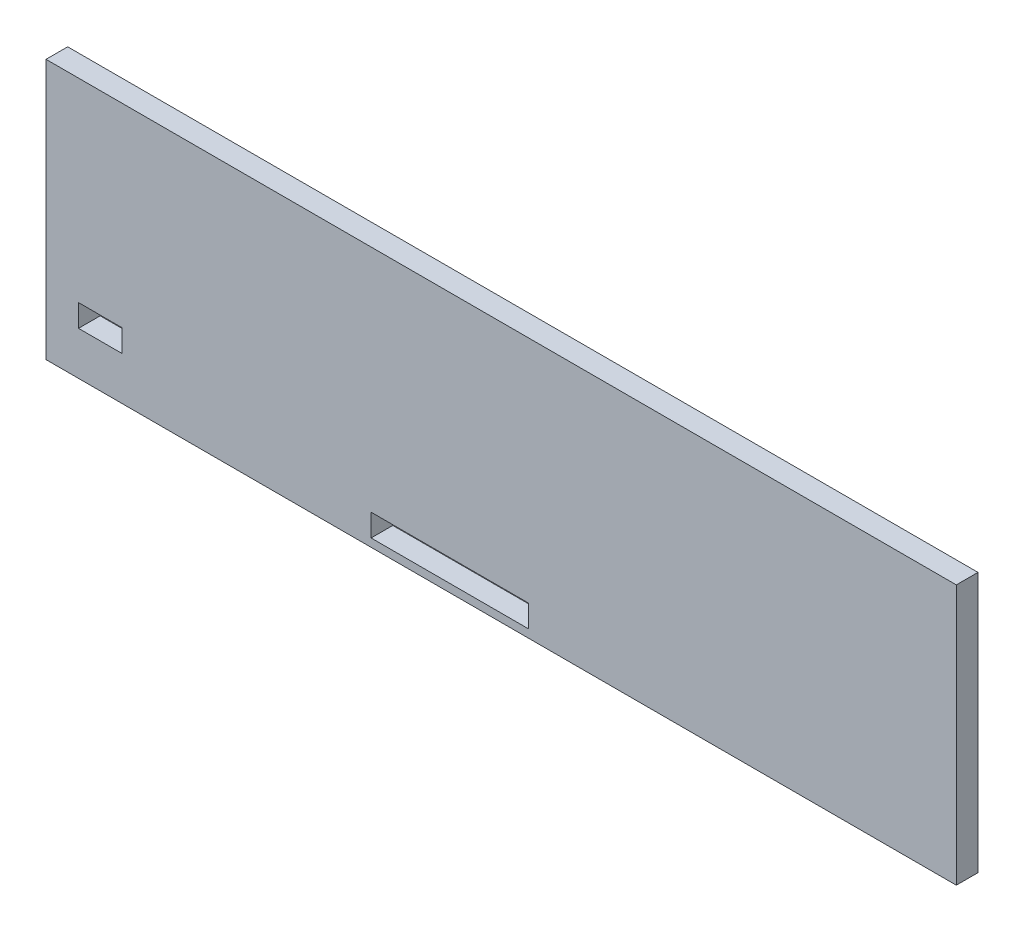
ISO-10303-21;
HEADER;
FILE_DESCRIPTION(('STEP AP214'),'2;1');
FILE_NAME('part.step','',(''),(''),'','','');
FILE_SCHEMA(('AUTOMOTIVE_DESIGN { 1 0 10303 214 1 1 1 1 }'));
ENDSEC;
DATA;
#1=APPLICATION_CONTEXT('core data for automotive mechanical design processes');
#2=APPLICATION_PROTOCOL_DEFINITION('international standard','automotive_design',2000,#1);
#3=PRODUCT_CONTEXT('',#1,'mechanical');
#4=PRODUCT('Part','Part','',(#3));
#5=PRODUCT_RELATED_PRODUCT_CATEGORY('part','',(#4));
#6=PRODUCT_DEFINITION_FORMATION('','',#4);
#7=PRODUCT_DEFINITION_CONTEXT('part definition',#1,'design');
#8=PRODUCT_DEFINITION('design','',#6,#7);
#9=PRODUCT_DEFINITION_SHAPE('','',#8);
#10=(LENGTH_UNIT() NAMED_UNIT(*) SI_UNIT(.MILLI.,.METRE.));
#11=(NAMED_UNIT(*) PLANE_ANGLE_UNIT() SI_UNIT($,.RADIAN.));
#12=(NAMED_UNIT(*) SI_UNIT($,.STERADIAN.) SOLID_ANGLE_UNIT());
#13=UNCERTAINTY_MEASURE_WITH_UNIT(LENGTH_MEASURE(1.E-05),#10,'distance_accuracy_value','');
#14=(GEOMETRIC_REPRESENTATION_CONTEXT(3) GLOBAL_UNCERTAINTY_ASSIGNED_CONTEXT((#13)) GLOBAL_UNIT_ASSIGNED_CONTEXT((#10,
#11,#12)) REPRESENTATION_CONTEXT('',''));
#15=CARTESIAN_POINT('',(0.,0.,0.));
#16=DIRECTION('',(0.,0.,1.));
#17=DIRECTION('',(1.,0.,0.));
#18=AXIS2_PLACEMENT_3D('',#15,#16,#17);
#19=CARTESIAN_POINT('',(0.,0.,12.7));
#20=DIRECTION('',(0.,0.,-1.));
#21=DIRECTION('',(-1.,0.,0.));
#22=AXIS2_PLACEMENT_3D('',#19,#20,#21);
#23=PLANE('',#22);
#24=DIRECTION('',(0.,-1.,0.));
#25=VECTOR('',#24,1.);
#26=CARTESIAN_POINT('',(19.05,25.4,12.7));
#27=LINE('',#26,#25);
#28=CARTESIAN_POINT('',(19.05,38.481,12.7));
#29=VERTEX_POINT('',#28);
#30=CARTESIAN_POINT('',(19.05,25.4,12.7));
#31=VERTEX_POINT('',#30);
#32=EDGE_CURVE('E164',#29,#31,#27,.T.);
#33=ORIENTED_EDGE('',*,*,#32,.F.);
#34=DIRECTION('',(-1.,0.,0.));
#35=VECTOR('',#34,1.);
#36=CARTESIAN_POINT('',(19.05,38.481,12.7));
#37=LINE('',#36,#35);
#38=CARTESIAN_POINT('',(44.45,38.481,12.7));
#39=VERTEX_POINT('',#38);
#40=EDGE_CURVE('E172',#39,#29,#37,.T.);
#41=ORIENTED_EDGE('',*,*,#40,.F.);
#42=DIRECTION('',(0.,1.,0.));
#43=VECTOR('',#42,1.);
#44=CARTESIAN_POINT('',(44.45,25.4,12.7));
#45=LINE('',#44,#43);
#46=CARTESIAN_POINT('',(44.45,25.4,12.7));
#47=VERTEX_POINT('',#46);
#48=EDGE_CURVE('E169',#47,#39,#45,.T.);
#49=ORIENTED_EDGE('',*,*,#48,.F.);
#50=DIRECTION('',(1.,0.,0.));
#51=VECTOR('',#50,1.);
#52=CARTESIAN_POINT('',(19.05,25.4,12.7));
#53=LINE('',#52,#51);
#54=EDGE_CURVE('E166',#31,#47,#53,.T.);
#55=ORIENTED_EDGE('',*,*,#54,.F.);
#56=EDGE_LOOP('',(#33,#41,#49,#55));
#57=FACE_BOUND('',#56,.T.);
#58=DIRECTION('',(0.,-1.,0.));
#59=VECTOR('',#58,1.);
#60=CARTESIAN_POINT('',(0.,0.,12.7));
#61=LINE('',#60,#59);
#62=CARTESIAN_POINT('',(0.,152.4,12.7));
#63=VERTEX_POINT('',#62);
#64=CARTESIAN_POINT('',(0.,0.,12.7));
#65=VERTEX_POINT('',#64);
#66=EDGE_CURVE('E195',#63,#65,#61,.T.);
#67=ORIENTED_EDGE('',*,*,#66,.T.);
#68=DIRECTION('',(1.,0.,0.));
#69=VECTOR('',#68,1.);
#70=CARTESIAN_POINT('',(0.,0.,12.7));
#71=LINE('',#70,#69);
#72=CARTESIAN_POINT('',(533.4,0.,12.7));
#73=VERTEX_POINT('',#72);
#74=EDGE_CURVE('E198',#65,#73,#71,.T.);
#75=ORIENTED_EDGE('',*,*,#74,.T.);
#76=DIRECTION('',(0.,1.,0.));
#77=VECTOR('',#76,1.);
#78=CARTESIAN_POINT('',(533.4,0.,12.7));
#79=LINE('',#78,#77);
#80=CARTESIAN_POINT('',(533.4,152.4,12.7));
#81=VERTEX_POINT('',#80);
#82=EDGE_CURVE('E201',#73,#81,#79,.T.);
#83=ORIENTED_EDGE('',*,*,#82,.T.);
#84=DIRECTION('',(-1.,0.,0.));
#85=VECTOR('',#84,1.);
#86=CARTESIAN_POINT('',(0.,152.4,12.7));
#87=LINE('',#86,#85);
#88=EDGE_CURVE('E203',#81,#63,#87,.T.);
#89=ORIENTED_EDGE('',*,*,#88,.T.);
#90=EDGE_LOOP('',(#67,#75,#83,#89));
#91=FACE_BOUND('',#90,.T.);
#92=DIRECTION('',(0.,-1.,0.));
#93=VECTOR('',#92,1.);
#94=CARTESIAN_POINT('',(190.5,4.7498,12.7));
#95=LINE('',#94,#93);
#96=CARTESIAN_POINT('',(190.5,17.8308,12.7));
#97=VERTEX_POINT('',#96);
#98=CARTESIAN_POINT('',(190.5,4.7498,12.7));
#99=VERTEX_POINT('',#98);
#100=EDGE_CURVE('E128',#97,#99,#95,.T.);
#101=ORIENTED_EDGE('',*,*,#100,.F.);
#102=DIRECTION('',(-1.,0.,0.));
#103=VECTOR('',#102,1.);
#104=CARTESIAN_POINT('',(190.5,17.8308,12.7));
#105=LINE('',#104,#103);
#106=CARTESIAN_POINT('',(282.702,17.8308,12.7));
#107=VERTEX_POINT('',#106);
#108=EDGE_CURVE('E150',#107,#97,#105,.T.);
#109=ORIENTED_EDGE('',*,*,#108,.F.);
#110=DIRECTION('',(0.,1.,0.));
#111=VECTOR('',#110,1.);
#112=CARTESIAN_POINT('',(282.702,4.7498,12.7));
#113=LINE('',#112,#111);
#114=CARTESIAN_POINT('',(282.702,4.7498,12.7));
#115=VERTEX_POINT('',#114);
#116=EDGE_CURVE('E148',#115,#107,#113,.T.);
#117=ORIENTED_EDGE('',*,*,#116,.F.);
#118=DIRECTION('',(1.,0.,0.));
#119=VECTOR('',#118,1.);
#120=CARTESIAN_POINT('',(190.5,4.7498,12.7));
#121=LINE('',#120,#119);
#122=EDGE_CURVE('E136',#99,#115,#121,.T.);
#123=ORIENTED_EDGE('',*,*,#122,.F.);
#124=EDGE_LOOP('',(#101,#109,#117,#123));
#125=FACE_BOUND('',#124,.T.);
#126=ADVANCED_FACE('F39',(#57,#91,#125),#23,.F.);
#127=CARTESIAN_POINT('',(0.,0.,0.));
#128=DIRECTION('',(0.,0.,-1.));
#129=DIRECTION('',(-1.,0.,0.));
#130=AXIS2_PLACEMENT_3D('',#127,#128,#129);
#131=PLANE('',#130);
#132=DIRECTION('',(0.,-1.,0.));
#133=VECTOR('',#132,1.);
#134=CARTESIAN_POINT('',(0.,0.,0.));
#135=LINE('',#134,#133);
#136=CARTESIAN_POINT('',(0.,152.4,0.));
#137=VERTEX_POINT('',#136);
#138=CARTESIAN_POINT('',(0.,0.,0.));
#139=VERTEX_POINT('',#138);
#140=EDGE_CURVE('E194',#137,#139,#135,.T.);
#141=ORIENTED_EDGE('',*,*,#140,.F.);
#142=DIRECTION('',(-1.,0.,0.));
#143=VECTOR('',#142,1.);
#144=CARTESIAN_POINT('',(0.,152.4,0.));
#145=LINE('',#144,#143);
#146=CARTESIAN_POINT('',(533.4,152.4,0.));
#147=VERTEX_POINT('',#146);
#148=EDGE_CURVE('E199',#147,#137,#145,.T.);
#149=ORIENTED_EDGE('',*,*,#148,.F.);
#150=DIRECTION('',(0.,1.,0.));
#151=VECTOR('',#150,1.);
#152=CARTESIAN_POINT('',(533.4,0.,0.));
#153=LINE('',#152,#151);
#154=CARTESIAN_POINT('',(533.4,0.,0.));
#155=VERTEX_POINT('',#154);
#156=EDGE_CURVE('E210',#155,#147,#153,.T.);
#157=ORIENTED_EDGE('',*,*,#156,.F.);
#158=DIRECTION('',(1.,0.,0.));
#159=VECTOR('',#158,1.);
#160=CARTESIAN_POINT('',(0.,0.,0.));
#161=LINE('',#160,#159);
#162=EDGE_CURVE('E208',#139,#155,#161,.T.);
#163=ORIENTED_EDGE('',*,*,#162,.F.);
#164=EDGE_LOOP('',(#141,#149,#157,#163));
#165=FACE_BOUND('',#164,.T.);
#166=DIRECTION('',(-1.,0.,0.));
#167=VECTOR('',#166,1.);
#168=CARTESIAN_POINT('',(19.05,38.481,0.));
#169=LINE('',#168,#167);
#170=CARTESIAN_POINT('',(44.45,38.481,0.));
#171=VERTEX_POINT('',#170);
#172=CARTESIAN_POINT('',(19.05,38.481,0.));
#173=VERTEX_POINT('',#172);
#174=EDGE_CURVE('E167',#171,#173,#169,.T.);
#175=ORIENTED_EDGE('',*,*,#174,.T.);
#176=DIRECTION('',(0.,-1.,0.));
#177=VECTOR('',#176,1.);
#178=CARTESIAN_POINT('',(19.05,25.4,0.));
#179=LINE('',#178,#177);
#180=CARTESIAN_POINT('',(19.05,25.4,0.));
#181=VERTEX_POINT('',#180);
#182=EDGE_CURVE('E144',#173,#181,#179,.T.);
#183=ORIENTED_EDGE('',*,*,#182,.T.);
#184=DIRECTION('',(1.,0.,0.));
#185=VECTOR('',#184,1.);
#186=CARTESIAN_POINT('',(19.05,25.4,0.));
#187=LINE('',#186,#185);
#188=CARTESIAN_POINT('',(44.45,25.4,0.));
#189=VERTEX_POINT('',#188);
#190=EDGE_CURVE('E177',#181,#189,#187,.T.);
#191=ORIENTED_EDGE('',*,*,#190,.T.);
#192=DIRECTION('',(0.,1.,0.));
#193=VECTOR('',#192,1.);
#194=CARTESIAN_POINT('',(44.45,25.4,0.));
#195=LINE('',#194,#193);
#196=EDGE_CURVE('E180',#189,#171,#195,.T.);
#197=ORIENTED_EDGE('',*,*,#196,.T.);
#198=EDGE_LOOP('',(#175,#183,#191,#197));
#199=FACE_BOUND('',#198,.T.);
#200=DIRECTION('',(-1.,0.,0.));
#201=VECTOR('',#200,1.);
#202=CARTESIAN_POINT('',(190.5,17.8308,0.));
#203=LINE('',#202,#201);
#204=CARTESIAN_POINT('',(282.702,17.8308,0.));
#205=VERTEX_POINT('',#204);
#206=CARTESIAN_POINT('',(190.5,17.8308,0.));
#207=VERTEX_POINT('',#206);
#208=EDGE_CURVE('E137',#205,#207,#203,.T.);
#209=ORIENTED_EDGE('',*,*,#208,.T.);
#210=DIRECTION('',(0.,-1.,0.));
#211=VECTOR('',#210,1.);
#212=CARTESIAN_POINT('',(190.5,4.7498,0.));
#213=LINE('',#212,#211);
#214=CARTESIAN_POINT('',(190.5,4.7498,0.));
#215=VERTEX_POINT('',#214);
#216=EDGE_CURVE('E62',#207,#215,#213,.T.);
#217=ORIENTED_EDGE('',*,*,#216,.T.);
#218=DIRECTION('',(1.,0.,0.));
#219=VECTOR('',#218,1.);
#220=CARTESIAN_POINT('',(190.5,4.7498,0.));
#221=LINE('',#220,#219);
#222=CARTESIAN_POINT('',(282.702,4.7498,0.));
#223=VERTEX_POINT('',#222);
#224=EDGE_CURVE('E143',#215,#223,#221,.T.);
#225=ORIENTED_EDGE('',*,*,#224,.T.);
#226=DIRECTION('',(0.,1.,0.));
#227=VECTOR('',#226,1.);
#228=CARTESIAN_POINT('',(282.702,4.7498,0.));
#229=LINE('',#228,#227);
#230=EDGE_CURVE('E156',#223,#205,#229,.T.);
#231=ORIENTED_EDGE('',*,*,#230,.T.);
#232=EDGE_LOOP('',(#209,#217,#225,#231));
#233=FACE_BOUND('',#232,.T.);
#234=ADVANCED_FACE('F228',(#165,#199,#233),#131,.T.);
#235=CARTESIAN_POINT('',(0.,0.,12.7));
#236=DIRECTION('',(1.,0.,0.));
#237=DIRECTION('',(0.,0.,-1.));
#238=AXIS2_PLACEMENT_3D('',#235,#236,#237);
#239=PLANE('',#238);
#240=ORIENTED_EDGE('',*,*,#140,.T.);
#241=DIRECTION('',(0.,0.,-1.));
#242=VECTOR('',#241,1.);
#243=CARTESIAN_POINT('',(0.,0.,12.7));
#244=LINE('',#243,#242);
#245=EDGE_CURVE('E11',#65,#139,#244,.T.);
#246=ORIENTED_EDGE('',*,*,#245,.F.);
#247=ORIENTED_EDGE('',*,*,#66,.F.);
#248=DIRECTION('',(0.,0.,-1.));
#249=VECTOR('',#248,1.);
#250=CARTESIAN_POINT('',(0.,152.4,12.7));
#251=LINE('',#250,#249);
#252=EDGE_CURVE('E205',#63,#137,#251,.T.);
#253=ORIENTED_EDGE('',*,*,#252,.T.);
#254=EDGE_LOOP('',(#240,#246,#247,#253));
#255=FACE_BOUND('',#254,.T.);
#256=ADVANCED_FACE('F41',(#255),#239,.F.);
#257=CARTESIAN_POINT('',(0.,0.,12.7));
#258=DIRECTION('',(0.,1.,0.));
#259=DIRECTION('',(0.,0.,1.));
#260=AXIS2_PLACEMENT_3D('',#257,#258,#259);
#261=PLANE('',#260);
#262=ORIENTED_EDGE('',*,*,#162,.T.);
#263=DIRECTION('',(0.,0.,-1.));
#264=VECTOR('',#263,1.);
#265=CARTESIAN_POINT('',(533.4,0.,12.7));
#266=LINE('',#265,#264);
#267=EDGE_CURVE('E47',#73,#155,#266,.T.);
#268=ORIENTED_EDGE('',*,*,#267,.F.);
#269=ORIENTED_EDGE('',*,*,#74,.F.);
#270=ORIENTED_EDGE('',*,*,#245,.T.);
#271=EDGE_LOOP('',(#262,#268,#269,#270));
#272=FACE_BOUND('',#271,.T.);
#273=ADVANCED_FACE('F238',(#272),#261,.F.);
#274=CARTESIAN_POINT('',(533.4,0.,12.7));
#275=DIRECTION('',(-1.,0.,0.));
#276=DIRECTION('',(0.,0.,1.));
#277=AXIS2_PLACEMENT_3D('',#274,#275,#276);
#278=PLANE('',#277);
#279=ORIENTED_EDGE('',*,*,#156,.T.);
#280=DIRECTION('',(0.,0.,-1.));
#281=VECTOR('',#280,1.);
#282=CARTESIAN_POINT('',(533.4,152.4,12.7));
#283=LINE('',#282,#281);
#284=EDGE_CURVE('E215',#81,#147,#283,.T.);
#285=ORIENTED_EDGE('',*,*,#284,.F.);
#286=ORIENTED_EDGE('',*,*,#82,.F.);
#287=ORIENTED_EDGE('',*,*,#267,.T.);
#288=EDGE_LOOP('',(#279,#285,#286,#287));
#289=FACE_BOUND('',#288,.T.);
#290=ADVANCED_FACE('F222',(#289),#278,.F.);
#291=CARTESIAN_POINT('',(0.,152.4,12.7));
#292=DIRECTION('',(0.,-1.,0.));
#293=DIRECTION('',(0.,0.,-1.));
#294=AXIS2_PLACEMENT_3D('',#291,#292,#293);
#295=PLANE('',#294);
#296=ORIENTED_EDGE('',*,*,#148,.T.);
#297=ORIENTED_EDGE('',*,*,#252,.F.);
#298=ORIENTED_EDGE('',*,*,#88,.F.);
#299=ORIENTED_EDGE('',*,*,#284,.T.);
#300=EDGE_LOOP('',(#296,#297,#298,#299));
#301=FACE_BOUND('',#300,.T.);
#302=ADVANCED_FACE('F232',(#301),#295,.F.);
#303=CARTESIAN_POINT('',(19.05,25.4,12.7));
#304=DIRECTION('',(1.,0.,0.));
#305=DIRECTION('',(0.,0.,-1.));
#306=AXIS2_PLACEMENT_3D('',#303,#304,#305);
#307=PLANE('',#306);
#308=ORIENTED_EDGE('',*,*,#182,.F.);
#309=DIRECTION('',(0.,0.,-1.));
#310=VECTOR('',#309,1.);
#311=CARTESIAN_POINT('',(19.05,38.481,12.7));
#312=LINE('',#311,#310);
#313=EDGE_CURVE('E174',#29,#173,#312,.T.);
#314=ORIENTED_EDGE('',*,*,#313,.F.);
#315=ORIENTED_EDGE('',*,*,#32,.T.);
#316=DIRECTION('',(0.,0.,-1.));
#317=VECTOR('',#316,1.);
#318=CARTESIAN_POINT('',(19.05,25.4,12.7));
#319=LINE('',#318,#317);
#320=EDGE_CURVE('E191',#31,#181,#319,.T.);
#321=ORIENTED_EDGE('',*,*,#320,.T.);
#322=EDGE_LOOP('',(#308,#314,#315,#321));
#323=FACE_BOUND('',#322,.T.);
#324=ADVANCED_FACE('F255',(#323),#307,.T.);
#325=CARTESIAN_POINT('',(19.05,25.4,12.7));
#326=DIRECTION('',(0.,1.,0.));
#327=DIRECTION('',(0.,0.,1.));
#328=AXIS2_PLACEMENT_3D('',#325,#326,#327);
#329=PLANE('',#328);
#330=ORIENTED_EDGE('',*,*,#190,.F.);
#331=ORIENTED_EDGE('',*,*,#320,.F.);
#332=ORIENTED_EDGE('',*,*,#54,.T.);
#333=DIRECTION('',(0.,0.,-1.));
#334=VECTOR('',#333,1.);
#335=CARTESIAN_POINT('',(44.45,25.4,12.7));
#336=LINE('',#335,#334);
#337=EDGE_CURVE('E189',#47,#189,#336,.T.);
#338=ORIENTED_EDGE('',*,*,#337,.T.);
#339=EDGE_LOOP('',(#330,#331,#332,#338));
#340=FACE_BOUND('',#339,.T.);
#341=ADVANCED_FACE('F262',(#340),#329,.T.);
#342=CARTESIAN_POINT('',(44.45,25.4,12.7));
#343=DIRECTION('',(-1.,0.,0.));
#344=DIRECTION('',(0.,0.,1.));
#345=AXIS2_PLACEMENT_3D('',#342,#343,#344);
#346=PLANE('',#345);
#347=ORIENTED_EDGE('',*,*,#196,.F.);
#348=ORIENTED_EDGE('',*,*,#337,.F.);
#349=ORIENTED_EDGE('',*,*,#48,.T.);
#350=DIRECTION('',(0.,0.,-1.));
#351=VECTOR('',#350,1.);
#352=CARTESIAN_POINT('',(44.45,38.481,12.7));
#353=LINE('',#352,#351);
#354=EDGE_CURVE('E187',#39,#171,#353,.T.);
#355=ORIENTED_EDGE('',*,*,#354,.T.);
#356=EDGE_LOOP('',(#347,#348,#349,#355));
#357=FACE_BOUND('',#356,.T.);
#358=ADVANCED_FACE('F267',(#357),#346,.T.);
#359=CARTESIAN_POINT('',(19.05,38.481,12.7));
#360=DIRECTION('',(0.,-1.,0.));
#361=DIRECTION('',(0.,0.,-1.));
#362=AXIS2_PLACEMENT_3D('',#359,#360,#361);
#363=PLANE('',#362);
#364=ORIENTED_EDGE('',*,*,#174,.F.);
#365=ORIENTED_EDGE('',*,*,#354,.F.);
#366=ORIENTED_EDGE('',*,*,#40,.T.);
#367=ORIENTED_EDGE('',*,*,#313,.T.);
#368=EDGE_LOOP('',(#364,#365,#366,#367));
#369=FACE_BOUND('',#368,.T.);
#370=ADVANCED_FACE('F273',(#369),#363,.T.);
#371=CARTESIAN_POINT('',(190.5,4.7498,12.7));
#372=DIRECTION('',(1.,0.,0.));
#373=DIRECTION('',(0.,0.,-1.));
#374=AXIS2_PLACEMENT_3D('',#371,#372,#373);
#375=PLANE('',#374);
#376=ORIENTED_EDGE('',*,*,#216,.F.);
#377=DIRECTION('',(0.,0.,-1.));
#378=VECTOR('',#377,1.);
#379=CARTESIAN_POINT('',(190.5,17.8308,12.7));
#380=LINE('',#379,#378);
#381=EDGE_CURVE('E132',#97,#207,#380,.T.);
#382=ORIENTED_EDGE('',*,*,#381,.F.);
#383=ORIENTED_EDGE('',*,*,#100,.T.);
#384=DIRECTION('',(0.,0.,-1.));
#385=VECTOR('',#384,1.);
#386=CARTESIAN_POINT('',(190.5,4.7498,12.7));
#387=LINE('',#386,#385);
#388=EDGE_CURVE('E131',#99,#215,#387,.T.);
#389=ORIENTED_EDGE('',*,*,#388,.T.);
#390=EDGE_LOOP('',(#376,#382,#383,#389));
#391=FACE_BOUND('',#390,.T.);
#392=ADVANCED_FACE('F130',(#391),#375,.T.);
#393=CARTESIAN_POINT('',(190.5,4.7498,12.7));
#394=DIRECTION('',(0.,1.,0.));
#395=DIRECTION('',(0.,0.,1.));
#396=AXIS2_PLACEMENT_3D('',#393,#394,#395);
#397=PLANE('',#396);
#398=ORIENTED_EDGE('',*,*,#224,.F.);
#399=ORIENTED_EDGE('',*,*,#388,.F.);
#400=ORIENTED_EDGE('',*,*,#122,.T.);
#401=DIRECTION('',(0.,0.,-1.));
#402=VECTOR('',#401,1.);
#403=CARTESIAN_POINT('',(282.702,4.7498,12.7));
#404=LINE('',#403,#402);
#405=EDGE_CURVE('E145',#115,#223,#404,.T.);
#406=ORIENTED_EDGE('',*,*,#405,.T.);
#407=EDGE_LOOP('',(#398,#399,#400,#406));
#408=FACE_BOUND('',#407,.T.);
#409=ADVANCED_FACE('F140',(#408),#397,.T.);
#410=CARTESIAN_POINT('',(282.702,4.7498,12.7));
#411=DIRECTION('',(-1.,0.,0.));
#412=DIRECTION('',(0.,0.,1.));
#413=AXIS2_PLACEMENT_3D('',#410,#411,#412);
#414=PLANE('',#413);
#415=ORIENTED_EDGE('',*,*,#230,.F.);
#416=ORIENTED_EDGE('',*,*,#405,.F.);
#417=ORIENTED_EDGE('',*,*,#116,.T.);
#418=DIRECTION('',(0.,0.,-1.));
#419=VECTOR('',#418,1.);
#420=CARTESIAN_POINT('',(282.702,17.8308,12.7));
#421=LINE('',#420,#419);
#422=EDGE_CURVE('E54',#107,#205,#421,.T.);
#423=ORIENTED_EDGE('',*,*,#422,.T.);
#424=EDGE_LOOP('',(#415,#416,#417,#423));
#425=FACE_BOUND('',#424,.T.);
#426=ADVANCED_FACE('F291',(#425),#414,.T.);
#427=CARTESIAN_POINT('',(190.5,17.8308,12.7));
#428=DIRECTION('',(0.,-1.,0.));
#429=DIRECTION('',(0.,0.,-1.));
#430=AXIS2_PLACEMENT_3D('',#427,#428,#429);
#431=PLANE('',#430);
#432=ORIENTED_EDGE('',*,*,#208,.F.);
#433=ORIENTED_EDGE('',*,*,#422,.F.);
#434=ORIENTED_EDGE('',*,*,#108,.T.);
#435=ORIENTED_EDGE('',*,*,#381,.T.);
#436=EDGE_LOOP('',(#432,#433,#434,#435));
#437=FACE_BOUND('',#436,.T.);
#438=ADVANCED_FACE('F294',(#437),#431,.T.);
#439=CLOSED_SHELL('',(#126,#234,#256,#273,#290,#302,#324,#341,#358,#370,#392,#409,#426,#438));
#440=MANIFOLD_SOLID_BREP('B2',#439);
#441=ADVANCED_BREP_SHAPE_REPRESENTATION('',(#18,#440),#14);
#442=SHAPE_DEFINITION_REPRESENTATION(#9,#441);
ENDSEC;
END-ISO-10303-21;
